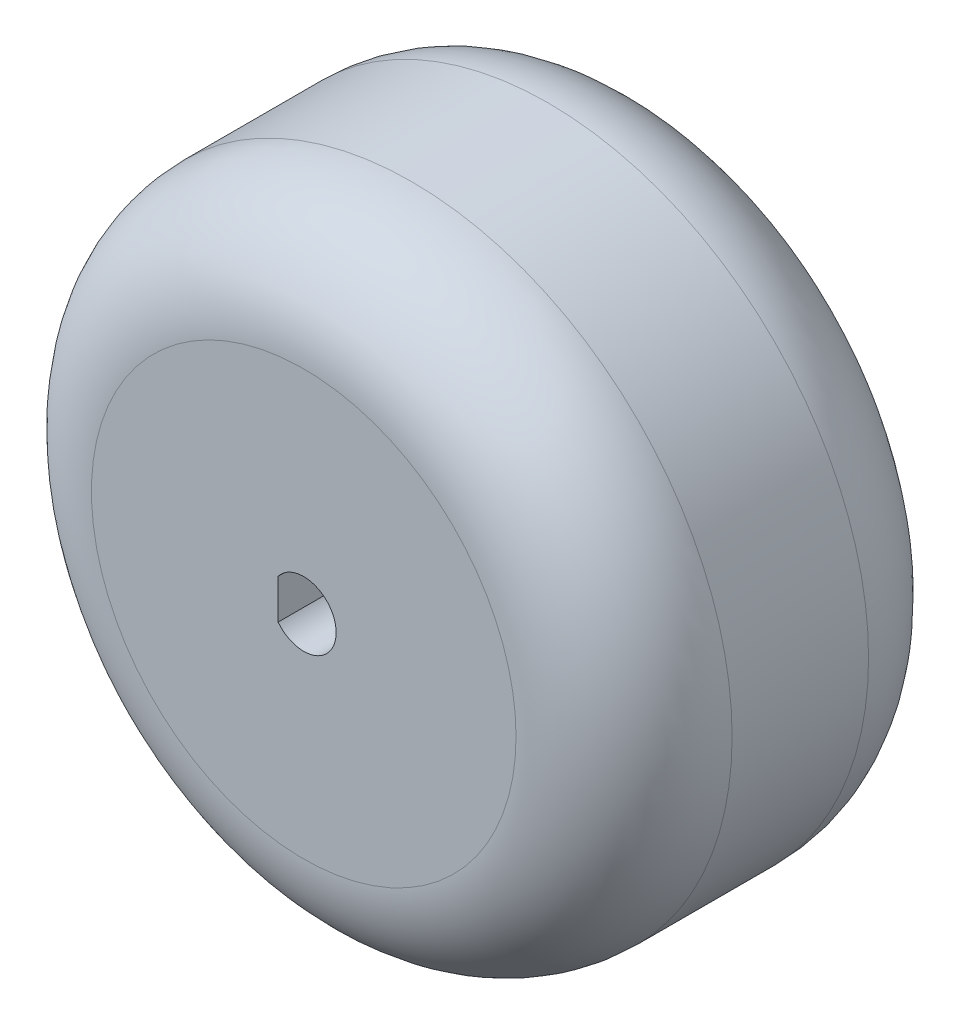
ISO-10303-21;
HEADER;
FILE_DESCRIPTION(('STEP AP214'),'2;1');
FILE_NAME('part.step','',(''),(''),'','','');
FILE_SCHEMA(('AUTOMOTIVE_DESIGN { 1 0 10303 214 1 1 1 1 }'));
ENDSEC;
DATA;
#1=APPLICATION_CONTEXT('core data for automotive mechanical design processes');
#2=APPLICATION_PROTOCOL_DEFINITION('international standard','automotive_design',2000,#1);
#3=PRODUCT_CONTEXT('',#1,'mechanical');
#4=PRODUCT('Part','Part','',(#3));
#5=PRODUCT_RELATED_PRODUCT_CATEGORY('part','',(#4));
#6=PRODUCT_DEFINITION_FORMATION('','',#4);
#7=PRODUCT_DEFINITION_CONTEXT('part definition',#1,'design');
#8=PRODUCT_DEFINITION('design','',#6,#7);
#9=PRODUCT_DEFINITION_SHAPE('','',#8);
#10=(LENGTH_UNIT() NAMED_UNIT(*) SI_UNIT(.MILLI.,.METRE.));
#11=(NAMED_UNIT(*) PLANE_ANGLE_UNIT() SI_UNIT($,.RADIAN.));
#12=(NAMED_UNIT(*) SI_UNIT($,.STERADIAN.) SOLID_ANGLE_UNIT());
#13=UNCERTAINTY_MEASURE_WITH_UNIT(LENGTH_MEASURE(1.E-05),#10,'distance_accuracy_value','');
#14=(GEOMETRIC_REPRESENTATION_CONTEXT(3) GLOBAL_UNCERTAINTY_ASSIGNED_CONTEXT((#13)) GLOBAL_UNIT_ASSIGNED_CONTEXT((#10,
#11,#12)) REPRESENTATION_CONTEXT('',''));
#15=CARTESIAN_POINT('',(0.,0.,0.));
#16=DIRECTION('',(0.,0.,1.));
#17=DIRECTION('',(1.,0.,0.));
#18=AXIS2_PLACEMENT_3D('',#15,#16,#17);
#19=CARTESIAN_POINT('',(-8.87201182024708,11.1616109593685,32.63));
#20=DIRECTION('',(0.,0.,-1.));
#21=DIRECTION('',(-1.,0.,0.));
#22=AXIS2_PLACEMENT_3D('',#19,#20,#21);
#23=CYLINDRICAL_SURFACE('',#22,29.65);
#24=CARTESIAN_POINT('',(-8.87201182024708,11.1616109593685,22.63));
#25=DIRECTION('',(0.,0.,1.));
#26=DIRECTION('',(1.,0.,0.));
#27=AXIS2_PLACEMENT_3D('',#24,#25,#26);
#28=CIRCLE('',#27,29.65);
#29=CARTESIAN_POINT('',(20.7779881797529,11.1616109593685,22.63));
#30=VERTEX_POINT('',#29);
#31=EDGE_CURVE('E11',#30,#30,#28,.F.);
#32=ORIENTED_EDGE('',*,*,#31,.T.);
#33=EDGE_LOOP('',(#32));
#34=FACE_BOUND('',#33,.T.);
#35=CARTESIAN_POINT('',(-8.87201182024708,11.1616109593685,10.));
#36=DIRECTION('',(0.,0.,1.));
#37=DIRECTION('',(1.,0.,0.));
#38=AXIS2_PLACEMENT_3D('',#35,#36,#37);
#39=CIRCLE('',#38,29.65);
#40=CARTESIAN_POINT('',(20.7779881797529,11.1616109593685,10.));
#41=VERTEX_POINT('',#40);
#42=EDGE_CURVE('E77',#41,#41,#39,.T.);
#43=ORIENTED_EDGE('',*,*,#42,.T.);
#44=EDGE_LOOP('',(#43));
#45=FACE_BOUND('',#44,.T.);
#46=ADVANCED_FACE('F32',(#34,#45),#23,.T.);
#47=CARTESIAN_POINT('',(-8.87201182024708,11.1616109593685,32.63));
#48=DIRECTION('',(0.,0.,1.));
#49=DIRECTION('',(1.,0.,0.));
#50=AXIS2_PLACEMENT_3D('',#47,#48,#49);
#51=PLANE('',#50);
#52=CARTESIAN_POINT('',(-8.87201182024708,11.1616109593685,32.63));
#53=DIRECTION('',(0.,0.,1.));
#54=DIRECTION('',(1.,0.,0.));
#55=AXIS2_PLACEMENT_3D('',#52,#53,#54);
#56=CIRCLE('',#55,19.65);
#57=CARTESIAN_POINT('',(10.7779881797529,11.1616109593685,32.63));
#58=VERTEX_POINT('',#57);
#59=EDGE_CURVE('E40',#58,#58,#56,.T.);
#60=ORIENTED_EDGE('',*,*,#59,.T.);
#61=EDGE_LOOP('',(#60));
#62=FACE_BOUND('',#61,.T.);
#63=CARTESIAN_POINT('',(-8.87201182024708,11.1616109593685,32.63));
#64=DIRECTION('',(0.,0.,1.));
#65=DIRECTION('',(1.,0.,0.));
#66=AXIS2_PLACEMENT_3D('',#63,#64,#65);
#67=CIRCLE('',#66,3.);
#68=CARTESIAN_POINT('',(-11.2420118202471,9.32229043265222,32.63));
#69=VERTEX_POINT('',#68);
#70=CARTESIAN_POINT('',(-11.2420118202471,13.0009314860849,32.63));
#71=VERTEX_POINT('',#70);
#72=EDGE_CURVE('E59',#69,#71,#67,.T.);
#73=ORIENTED_EDGE('',*,*,#72,.F.);
#74=DIRECTION('',(0.,1.,0.));
#75=VECTOR('',#74,1.);
#76=CARTESIAN_POINT('',(-11.2420118202471,14.0206895642066,32.63));
#77=LINE('',#76,#75);
#78=EDGE_CURVE('E62',#69,#71,#77,.T.);
#79=ORIENTED_EDGE('',*,*,#78,.T.);
#80=EDGE_LOOP('',(#73,#79));
#81=FACE_BOUND('',#80,.T.);
#82=ADVANCED_FACE('F60',(#62,#81),#51,.T.);
#83=CARTESIAN_POINT('',(-8.87201182024708,11.1616109593685,0.));
#84=DIRECTION('',(0.,0.,1.));
#85=DIRECTION('',(1.,0.,0.));
#86=AXIS2_PLACEMENT_3D('',#83,#84,#85);
#87=PLANE('',#86);
#88=CARTESIAN_POINT('',(-8.87201182024708,11.1616109593685,0.));
#89=DIRECTION('',(0.,0.,1.));
#90=DIRECTION('',(1.,0.,0.));
#91=AXIS2_PLACEMENT_3D('',#88,#89,#90);
#92=CIRCLE('',#91,19.65);
#93=CARTESIAN_POINT('',(10.7779881797529,11.1616109593685,0.));
#94=VERTEX_POINT('',#93);
#95=EDGE_CURVE('E80',#94,#94,#92,.F.);
#96=ORIENTED_EDGE('',*,*,#95,.T.);
#97=EDGE_LOOP('',(#96));
#98=FACE_BOUND('',#97,.T.);
#99=DIRECTION('',(0.,1.,0.));
#100=VECTOR('',#99,1.);
#101=CARTESIAN_POINT('',(-11.2420118202471,14.0206895642066,0.));
#102=LINE('',#101,#100);
#103=CARTESIAN_POINT('',(-11.2420118202471,9.32229043265222,0.));
#104=VERTEX_POINT('',#103);
#105=CARTESIAN_POINT('',(-11.2420118202471,13.0009314860849,0.));
#106=VERTEX_POINT('',#105);
#107=EDGE_CURVE('E63',#104,#106,#102,.T.);
#108=ORIENTED_EDGE('',*,*,#107,.F.);
#109=CARTESIAN_POINT('',(-8.87201182024708,11.1616109593685,0.));
#110=DIRECTION('',(0.,0.,1.));
#111=DIRECTION('',(1.,0.,0.));
#112=AXIS2_PLACEMENT_3D('',#109,#110,#111);
#113=CIRCLE('',#112,3.);
#114=EDGE_CURVE('E47',#104,#106,#113,.T.);
#115=ORIENTED_EDGE('',*,*,#114,.T.);
#116=EDGE_LOOP('',(#108,#115));
#117=FACE_BOUND('',#116,.T.);
#118=ADVANCED_FACE('F100',(#98,#117),#87,.F.);
#119=CARTESIAN_POINT('',(-8.87201182024708,11.1616109593685,-1.));
#120=DIRECTION('',(0.,0.,1.));
#121=DIRECTION('',(1.,0.,0.));
#122=AXIS2_PLACEMENT_3D('',#119,#120,#121);
#123=CYLINDRICAL_SURFACE('',#122,3.);
#124=ORIENTED_EDGE('',*,*,#72,.T.);
#125=DIRECTION('',(0.,0.,1.));
#126=VECTOR('',#125,1.);
#127=CARTESIAN_POINT('',(-11.2420118202471,13.0009314860849,-1.));
#128=LINE('',#127,#126);
#129=EDGE_CURVE('E52',#71,#106,#128,.F.);
#130=ORIENTED_EDGE('',*,*,#129,.T.);
#131=ORIENTED_EDGE('',*,*,#114,.F.);
#132=DIRECTION('',(0.,0.,1.));
#133=VECTOR('',#132,1.);
#134=CARTESIAN_POINT('',(-11.2420118202471,9.32229043265222,-1.));
#135=LINE('',#134,#133);
#136=EDGE_CURVE('E65',#104,#69,#135,.T.);
#137=ORIENTED_EDGE('',*,*,#136,.T.);
#138=EDGE_LOOP('',(#124,#130,#131,#137));
#139=FACE_BOUND('',#138,.T.);
#140=ADVANCED_FACE('F66',(#139),#123,.F.);
#141=CARTESIAN_POINT('',(-11.2420118202471,14.0206895642066,0.));
#142=DIRECTION('',(1.,0.,0.));
#143=DIRECTION('',(0.,0.,-1.));
#144=AXIS2_PLACEMENT_3D('',#141,#142,#143);
#145=PLANE('',#144);
#146=ORIENTED_EDGE('',*,*,#129,.F.);
#147=ORIENTED_EDGE('',*,*,#78,.F.);
#148=ORIENTED_EDGE('',*,*,#136,.F.);
#149=ORIENTED_EDGE('',*,*,#107,.T.);
#150=EDGE_LOOP('',(#146,#147,#148,#149));
#151=FACE_BOUND('',#150,.T.);
#152=ADVANCED_FACE('F71',(#151),#145,.T.);
#153=CARTESIAN_POINT('',(-8.87201182024708,11.1616109593685,10.));
#154=DIRECTION('',(0.,0.,1.));
#155=DIRECTION('',(1.,0.,0.));
#156=AXIS2_PLACEMENT_3D('',#153,#154,#155);
#157=TOROIDAL_SURFACE('',#156,19.65,10.);
#158=ORIENTED_EDGE('',*,*,#95,.F.);
#159=EDGE_LOOP('',(#158));
#160=FACE_BOUND('',#159,.T.);
#161=ORIENTED_EDGE('',*,*,#42,.F.);
#162=EDGE_LOOP('',(#161));
#163=FACE_BOUND('',#162,.T.);
#164=ADVANCED_FACE('F87',(#160,#163),#157,.T.);
#165=CARTESIAN_POINT('',(-8.87201182024708,11.1616109593685,22.63));
#166=DIRECTION('',(0.,0.,1.));
#167=DIRECTION('',(1.,0.,0.));
#168=AXIS2_PLACEMENT_3D('',#165,#166,#167);
#169=TOROIDAL_SURFACE('',#168,19.65,10.);
#170=ORIENTED_EDGE('',*,*,#31,.F.);
#171=EDGE_LOOP('',(#170));
#172=FACE_BOUND('',#171,.T.);
#173=ORIENTED_EDGE('',*,*,#59,.F.);
#174=EDGE_LOOP('',(#173));
#175=FACE_BOUND('',#174,.T.);
#176=ADVANCED_FACE('F34',(#172,#175),#169,.T.);
#177=CLOSED_SHELL('',(#46,#82,#118,#140,#152,#164,#176));
#178=MANIFOLD_SOLID_BREP('B2',#177);
#179=ADVANCED_BREP_SHAPE_REPRESENTATION('',(#18,#178),#14);
#180=SHAPE_DEFINITION_REPRESENTATION(#9,#179);
ENDSEC;
END-ISO-10303-21;
